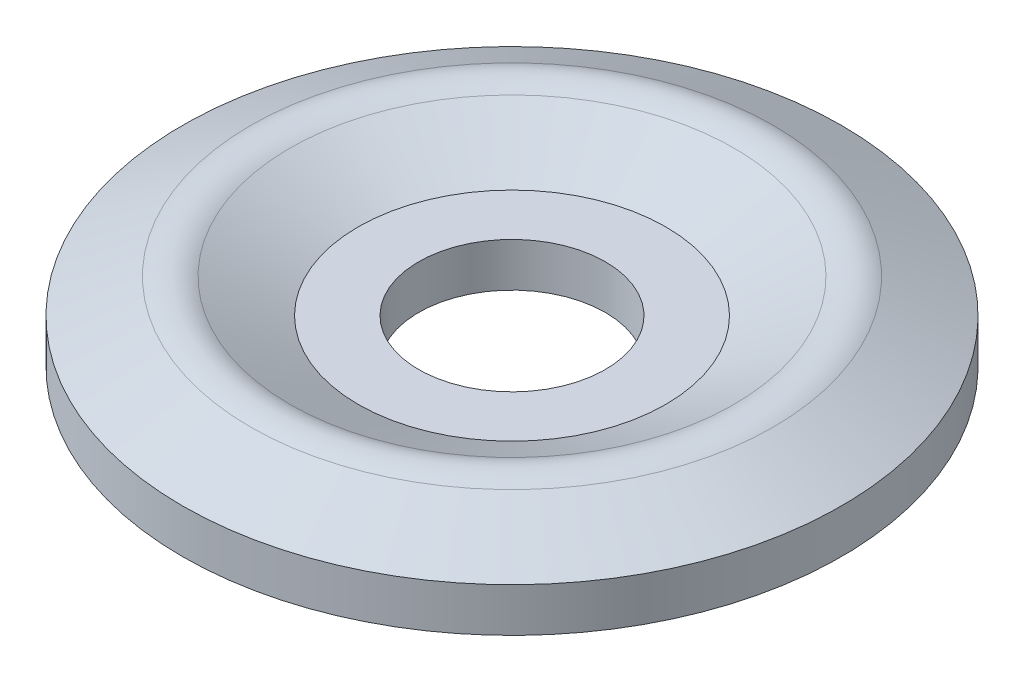
ISO-10303-21;
HEADER;
FILE_DESCRIPTION(('STEP AP214'),'2;1');
FILE_NAME('part.step','',(''),(''),'','','');
FILE_SCHEMA(('AUTOMOTIVE_DESIGN { 1 0 10303 214 1 1 1 1 }'));
ENDSEC;
DATA;
#1=APPLICATION_CONTEXT('core data for automotive mechanical design processes');
#2=APPLICATION_PROTOCOL_DEFINITION('international standard','automotive_design',2000,#1);
#3=PRODUCT_CONTEXT('',#1,'mechanical');
#4=PRODUCT('Part','Part','',(#3));
#5=PRODUCT_RELATED_PRODUCT_CATEGORY('part','',(#4));
#6=PRODUCT_DEFINITION_FORMATION('','',#4);
#7=PRODUCT_DEFINITION_CONTEXT('part definition',#1,'design');
#8=PRODUCT_DEFINITION('design','',#6,#7);
#9=PRODUCT_DEFINITION_SHAPE('','',#8);
#10=(LENGTH_UNIT() NAMED_UNIT(*) SI_UNIT(.MILLI.,.METRE.));
#11=(NAMED_UNIT(*) PLANE_ANGLE_UNIT() SI_UNIT($,.RADIAN.));
#12=(NAMED_UNIT(*) SI_UNIT($,.STERADIAN.) SOLID_ANGLE_UNIT());
#13=UNCERTAINTY_MEASURE_WITH_UNIT(LENGTH_MEASURE(1.E-05),#10,'distance_accuracy_value','');
#14=(GEOMETRIC_REPRESENTATION_CONTEXT(3) GLOBAL_UNCERTAINTY_ASSIGNED_CONTEXT((#13)) GLOBAL_UNIT_ASSIGNED_CONTEXT((#10,
#11,#12)) REPRESENTATION_CONTEXT('',''));
#15=CARTESIAN_POINT('',(0.,0.,0.));
#16=DIRECTION('',(0.,0.,1.));
#17=DIRECTION('',(1.,0.,0.));
#18=AXIS2_PLACEMENT_3D('',#15,#16,#17);
#19=CARTESIAN_POINT('',(0.,-2.,0.));
#20=DIRECTION('',(0.,-1.,0.));
#21=DIRECTION('',(0.,0.,-1.));
#22=AXIS2_PLACEMENT_3D('',#19,#20,#21);
#23=CYLINDRICAL_SURFACE('',#22,4.24999999999999);
#24=CARTESIAN_POINT('',(0.,-2.,0.));
#25=DIRECTION('',(0.,-1.,0.));
#26=DIRECTION('',(0.,0.,-1.));
#27=AXIS2_PLACEMENT_3D('',#24,#25,#26);
#28=CIRCLE('',#27,4.24999999999999);
#29=CARTESIAN_POINT('',(0.,-2.,-4.24999999999999));
#30=VERTEX_POINT('',#29);
#31=EDGE_CURVE('E74',#30,#30,#28,.T.);
#32=ORIENTED_EDGE('',*,*,#31,.T.);
#33=EDGE_LOOP('',(#32));
#34=FACE_BOUND('',#33,.T.);
#35=CARTESIAN_POINT('',(0.,0.,0.));
#36=DIRECTION('',(0.,-1.,0.));
#37=DIRECTION('',(0.,0.,-1.));
#38=AXIS2_PLACEMENT_3D('',#35,#36,#37);
#39=CIRCLE('',#38,4.24999999999999);
#40=CARTESIAN_POINT('',(0.,0.,-4.24999999999999));
#41=VERTEX_POINT('',#40);
#42=EDGE_CURVE('E59',#41,#41,#39,.T.);
#43=ORIENTED_EDGE('',*,*,#42,.F.);
#44=EDGE_LOOP('',(#43));
#45=FACE_BOUND('',#44,.T.);
#46=ADVANCED_FACE('F39',(#34,#45),#23,.F.);
#47=CARTESIAN_POINT('',(0.,0.,0.));
#48=DIRECTION('',(0.,1.,0.));
#49=DIRECTION('',(0.,0.,1.));
#50=AXIS2_PLACEMENT_3D('',#47,#48,#49);
#51=PLANE('',#50);
#52=ORIENTED_EDGE('',*,*,#42,.T.);
#53=EDGE_LOOP('',(#52));
#54=FACE_BOUND('',#53,.T.);
#55=CARTESIAN_POINT('',(0.,0.,0.));
#56=DIRECTION('',(0.,-1.,0.));
#57=DIRECTION('',(0.,0.,-1.));
#58=AXIS2_PLACEMENT_3D('',#55,#56,#57);
#59=CIRCLE('',#58,7.);
#60=CARTESIAN_POINT('',(0.,0.,-7.));
#61=VERTEX_POINT('',#60);
#62=EDGE_CURVE('E62',#61,#61,#59,.T.);
#63=ORIENTED_EDGE('',*,*,#62,.F.);
#64=EDGE_LOOP('',(#63));
#65=FACE_BOUND('',#64,.T.);
#66=ADVANCED_FACE('F98',(#54,#65),#51,.T.);
#67=CARTESIAN_POINT('',(0.,2.,0.));
#68=DIRECTION('',(0.,1.,0.));
#69=DIRECTION('',(0.,0.,1.));
#70=AXIS2_PLACEMENT_3D('',#67,#68,#69);
#71=CONICAL_SURFACE('',#70,11.,1.10714871779409);
#72=CARTESIAN_POINT('',(0.,1.55278640450004,0.));
#73=DIRECTION('',(0.,1.,0.));
#74=DIRECTION('',(0.,0.,1.));
#75=AXIS2_PLACEMENT_3D('',#72,#73,#74);
#76=CIRCLE('',#75,10.1055728090001);
#77=CARTESIAN_POINT('',(0.,1.55278640450004,10.1055728090001));
#78=VERTEX_POINT('',#77);
#79=EDGE_CURVE('E50',#78,#78,#76,.T.);
#80=ORIENTED_EDGE('',*,*,#79,.T.);
#81=EDGE_LOOP('',(#80));
#82=FACE_BOUND('',#81,.T.);
#83=ORIENTED_EDGE('',*,*,#62,.T.);
#84=EDGE_LOOP('',(#83));
#85=FACE_BOUND('',#84,.T.);
#86=ADVANCED_FACE('F103',(#82,#85),#71,.F.);
#87=CARTESIAN_POINT('',(0.,2.,0.));
#88=DIRECTION('',(0.,-1.,0.));
#89=DIRECTION('',(0.,0.,-1.));
#90=AXIS2_PLACEMENT_3D('',#87,#88,#89);
#91=CONICAL_SURFACE('',#90,11.,1.10714871779409);
#92=CARTESIAN_POINT('',(0.,1.55278640450004,0.));
#93=DIRECTION('',(0.,-1.,0.));
#94=DIRECTION('',(0.,0.,-1.));
#95=AXIS2_PLACEMENT_3D('',#92,#93,#94);
#96=CIRCLE('',#95,11.8944271909999);
#97=CARTESIAN_POINT('',(0.,1.55278640450004,-11.8944271909999));
#98=VERTEX_POINT('',#97);
#99=EDGE_CURVE('E54',#98,#98,#96,.T.);
#100=ORIENTED_EDGE('',*,*,#99,.T.);
#101=EDGE_LOOP('',(#100));
#102=FACE_BOUND('',#101,.T.);
#103=CARTESIAN_POINT('',(0.,0.,0.));
#104=DIRECTION('',(0.,-1.,0.));
#105=DIRECTION('',(0.,0.,-1.));
#106=AXIS2_PLACEMENT_3D('',#103,#104,#105);
#107=CIRCLE('',#106,15.);
#108=CARTESIAN_POINT('',(0.,0.,-15.));
#109=VERTEX_POINT('',#108);
#110=EDGE_CURVE('E65',#109,#109,#107,.T.);
#111=ORIENTED_EDGE('',*,*,#110,.F.);
#112=EDGE_LOOP('',(#111));
#113=FACE_BOUND('',#112,.T.);
#114=ADVANCED_FACE('F116',(#102,#113),#91,.T.);
#115=CARTESIAN_POINT('',(0.,-2.,0.));
#116=DIRECTION('',(0.,-1.,0.));
#117=DIRECTION('',(0.,0.,-1.));
#118=AXIS2_PLACEMENT_3D('',#115,#116,#117);
#119=CYLINDRICAL_SURFACE('',#118,15.);
#120=ORIENTED_EDGE('',*,*,#110,.T.);
#121=EDGE_LOOP('',(#120));
#122=FACE_BOUND('',#121,.T.);
#123=CARTESIAN_POINT('',(0.,-2.,0.));
#124=DIRECTION('',(0.,-1.,0.));
#125=DIRECTION('',(0.,0.,-1.));
#126=AXIS2_PLACEMENT_3D('',#123,#124,#125);
#127=CIRCLE('',#126,15.);
#128=CARTESIAN_POINT('',(0.,-2.,-15.));
#129=VERTEX_POINT('',#128);
#130=EDGE_CURVE('E68',#129,#129,#127,.T.);
#131=ORIENTED_EDGE('',*,*,#130,.F.);
#132=EDGE_LOOP('',(#131));
#133=FACE_BOUND('',#132,.T.);
#134=ADVANCED_FACE('F95',(#122,#133),#119,.T.);
#135=CARTESIAN_POINT('',(0.,-2.,0.));
#136=DIRECTION('',(0.,-1.,0.));
#137=DIRECTION('',(0.,0.,-1.));
#138=AXIS2_PLACEMENT_3D('',#135,#136,#137);
#139=CONICAL_SURFACE('',#138,15.,1.10714871779409);
#140=CARTESIAN_POINT('',(0.,-0.44721359549996,0.));
#141=DIRECTION('',(0.,-1.,0.));
#142=DIRECTION('',(0.,0.,-1.));
#143=AXIS2_PLACEMENT_3D('',#140,#141,#142);
#144=CIRCLE('',#143,11.8944271909999);
#145=CARTESIAN_POINT('',(0.,-0.44721359549996,-11.8944271909999));
#146=VERTEX_POINT('',#145);
#147=EDGE_CURVE('E10',#146,#146,#144,.F.);
#148=ORIENTED_EDGE('',*,*,#147,.T.);
#149=EDGE_LOOP('',(#148));
#150=FACE_BOUND('',#149,.T.);
#151=ORIENTED_EDGE('',*,*,#130,.T.);
#152=EDGE_LOOP('',(#151));
#153=FACE_BOUND('',#152,.T.);
#154=ADVANCED_FACE('F89',(#150,#153),#139,.F.);
#155=CARTESIAN_POINT('',(0.,0.,0.));
#156=DIRECTION('',(0.,1.,0.));
#157=DIRECTION('',(0.,0.,1.));
#158=AXIS2_PLACEMENT_3D('',#155,#156,#157);
#159=CONICAL_SURFACE('',#158,11.,1.10714871779409);
#160=CARTESIAN_POINT('',(0.,-0.44721359549996,0.));
#161=DIRECTION('',(0.,1.,0.));
#162=DIRECTION('',(0.,0.,1.));
#163=AXIS2_PLACEMENT_3D('',#160,#161,#162);
#164=CIRCLE('',#163,10.1055728090001);
#165=CARTESIAN_POINT('',(0.,-0.44721359549996,10.1055728090001));
#166=VERTEX_POINT('',#165);
#167=EDGE_CURVE('E46',#166,#166,#164,.F.);
#168=ORIENTED_EDGE('',*,*,#167,.T.);
#169=EDGE_LOOP('',(#168));
#170=FACE_BOUND('',#169,.T.);
#171=CARTESIAN_POINT('',(0.,-2.,0.));
#172=DIRECTION('',(0.,-1.,0.));
#173=DIRECTION('',(0.,0.,-1.));
#174=AXIS2_PLACEMENT_3D('',#171,#172,#173);
#175=CIRCLE('',#174,7.);
#176=CARTESIAN_POINT('',(0.,-2.,-6.99999999999999));
#177=VERTEX_POINT('',#176);
#178=EDGE_CURVE('E71',#177,#177,#175,.T.);
#179=ORIENTED_EDGE('',*,*,#178,.F.);
#180=EDGE_LOOP('',(#179));
#181=FACE_BOUND('',#180,.T.);
#182=ADVANCED_FACE('F84',(#170,#181),#159,.T.);
#183=CARTESIAN_POINT('',(0.,-2.,0.));
#184=DIRECTION('',(0.,1.,0.));
#185=DIRECTION('',(0.,0.,1.));
#186=AXIS2_PLACEMENT_3D('',#183,#184,#185);
#187=PLANE('',#186);
#188=ORIENTED_EDGE('',*,*,#31,.F.);
#189=EDGE_LOOP('',(#188));
#190=FACE_BOUND('',#189,.T.);
#191=ORIENTED_EDGE('',*,*,#178,.T.);
#192=EDGE_LOOP('',(#191));
#193=FACE_BOUND('',#192,.T.);
#194=ADVANCED_FACE('F80',(#190,#193),#187,.F.);
#195=CARTESIAN_POINT('',(0.,-0.23606797749979,0.));
#196=DIRECTION('',(0.,1.,0.));
#197=DIRECTION('',(0.,0.,1.));
#198=AXIS2_PLACEMENT_3D('',#195,#196,#197);
#199=TOROIDAL_SURFACE('',#198,11.,2.);
#200=ORIENTED_EDGE('',*,*,#79,.F.);
#201=EDGE_LOOP('',(#200));
#202=FACE_BOUND('',#201,.T.);
#203=ORIENTED_EDGE('',*,*,#99,.F.);
#204=EDGE_LOOP('',(#203));
#205=FACE_BOUND('',#204,.T.);
#206=ADVANCED_FACE('F83',(#202,#205),#199,.T.);
#207=CARTESIAN_POINT('',(0.,-2.23606797749979,0.));
#208=DIRECTION('',(0.,-1.,0.));
#209=DIRECTION('',(0.,0.,-1.));
#210=AXIS2_PLACEMENT_3D('',#207,#208,#209);
#211=TOROIDAL_SURFACE('',#210,11.,2.);
#212=ORIENTED_EDGE('',*,*,#147,.F.);
#213=EDGE_LOOP('',(#212));
#214=FACE_BOUND('',#213,.T.);
#215=ORIENTED_EDGE('',*,*,#167,.F.);
#216=EDGE_LOOP('',(#215));
#217=FACE_BOUND('',#216,.T.);
#218=ADVANCED_FACE('F41',(#214,#217),#211,.F.);
#219=CLOSED_SHELL('',(#46,#66,#86,#114,#134,#154,#182,#194,#206,#218));
#220=MANIFOLD_SOLID_BREP('B2',#219);
#221=ADVANCED_BREP_SHAPE_REPRESENTATION('',(#18,#220),#14);
#222=SHAPE_DEFINITION_REPRESENTATION(#9,#221);
ENDSEC;
END-ISO-10303-21;
